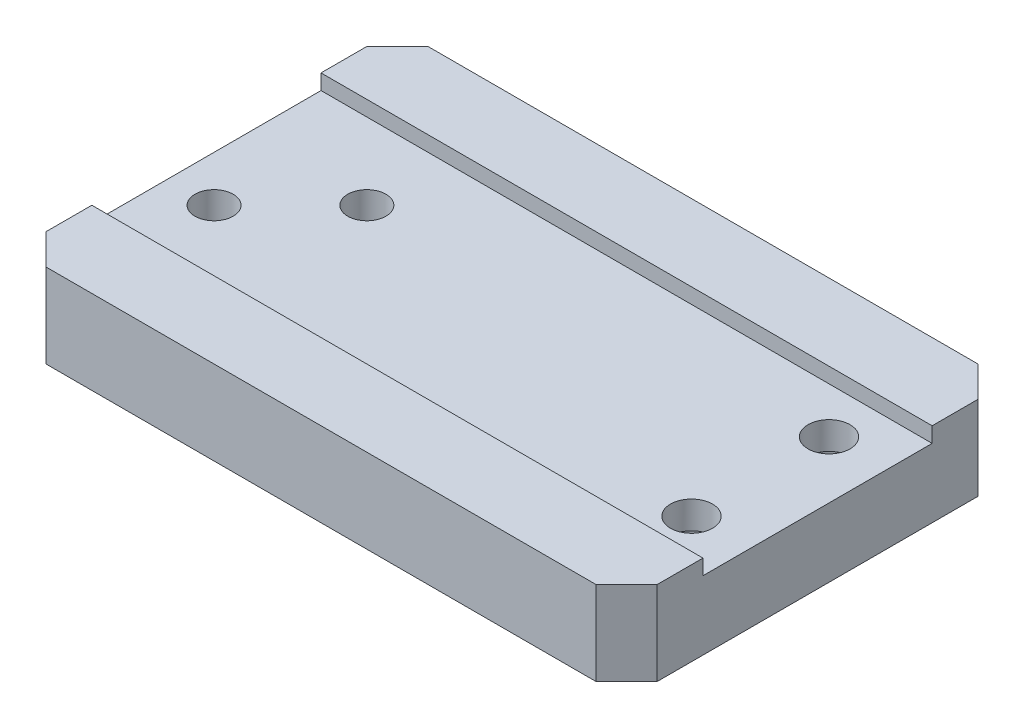
ISO-10303-21;
HEADER;
FILE_DESCRIPTION(('STEP AP214'),'2;1');
FILE_NAME('part.step','',(''),(''),'','','');
FILE_SCHEMA(('AUTOMOTIVE_DESIGN { 1 0 10303 214 1 1 1 1 }'));
ENDSEC;
DATA;
#1=APPLICATION_CONTEXT('core data for automotive mechanical design processes');
#2=APPLICATION_PROTOCOL_DEFINITION('international standard','automotive_design',2000,#1);
#3=PRODUCT_CONTEXT('',#1,'mechanical');
#4=PRODUCT('Part','Part','',(#3));
#5=PRODUCT_RELATED_PRODUCT_CATEGORY('part','',(#4));
#6=PRODUCT_DEFINITION_FORMATION('','',#4);
#7=PRODUCT_DEFINITION_CONTEXT('part definition',#1,'design');
#8=PRODUCT_DEFINITION('design','',#6,#7);
#9=PRODUCT_DEFINITION_SHAPE('','',#8);
#10=(LENGTH_UNIT() NAMED_UNIT(*) SI_UNIT(.MILLI.,.METRE.));
#11=(NAMED_UNIT(*) PLANE_ANGLE_UNIT() SI_UNIT($,.RADIAN.));
#12=(NAMED_UNIT(*) SI_UNIT($,.STERADIAN.) SOLID_ANGLE_UNIT());
#13=UNCERTAINTY_MEASURE_WITH_UNIT(LENGTH_MEASURE(1.E-05),#10,'distance_accuracy_value','');
#14=(GEOMETRIC_REPRESENTATION_CONTEXT(3) GLOBAL_UNCERTAINTY_ASSIGNED_CONTEXT((#13)) GLOBAL_UNIT_ASSIGNED_CONTEXT((#10,
#11,#12)) REPRESENTATION_CONTEXT('',''));
#15=CARTESIAN_POINT('',(0.,0.,0.));
#16=DIRECTION('',(0.,0.,1.));
#17=DIRECTION('',(1.,0.,0.));
#18=AXIS2_PLACEMENT_3D('',#15,#16,#17);
#19=CARTESIAN_POINT('',(72.5,0.,9.));
#20=DIRECTION('',(0.,1.,0.));
#21=DIRECTION('',(0.,0.,1.));
#22=AXIS2_PLACEMENT_3D('',#19,#20,#21);
#23=CYLINDRICAL_SURFACE('',#22,2.75000000000001);
#24=CARTESIAN_POINT('',(72.5,9.,9.));
#25=DIRECTION('',(0.,1.,0.));
#26=DIRECTION('',(0.,0.,1.));
#27=AXIS2_PLACEMENT_3D('',#24,#25,#26);
#28=CIRCLE('',#27,2.75000000000001);
#29=CARTESIAN_POINT('',(72.5,9.,11.75));
#30=VERTEX_POINT('',#29);
#31=EDGE_CURVE('E264',#30,#30,#28,.T.);
#32=ORIENTED_EDGE('',*,*,#31,.T.);
#33=EDGE_LOOP('',(#32));
#34=FACE_BOUND('',#33,.T.);
#35=CARTESIAN_POINT('',(72.5,5.4,9.));
#36=DIRECTION('',(0.,-1.,0.));
#37=DIRECTION('',(0.,0.,-1.));
#38=AXIS2_PLACEMENT_3D('',#35,#36,#37);
#39=CIRCLE('',#38,2.75000000000001);
#40=CARTESIAN_POINT('',(72.5,5.4,6.24999999999999));
#41=VERTEX_POINT('',#40);
#42=EDGE_CURVE('E53',#41,#41,#39,.F.);
#43=ORIENTED_EDGE('',*,*,#42,.F.);
#44=EDGE_LOOP('',(#43));
#45=FACE_BOUND('',#44,.T.);
#46=ADVANCED_FACE('F48',(#34,#45),#23,.F.);
#47=CARTESIAN_POINT('',(72.5,0.,-9.));
#48=DIRECTION('',(0.,1.,0.));
#49=DIRECTION('',(0.,0.,1.));
#50=AXIS2_PLACEMENT_3D('',#47,#48,#49);
#51=CYLINDRICAL_SURFACE('',#50,2.75000000000001);
#52=CARTESIAN_POINT('',(72.5,9.,-9.));
#53=DIRECTION('',(0.,1.,0.));
#54=DIRECTION('',(0.,0.,1.));
#55=AXIS2_PLACEMENT_3D('',#52,#53,#54);
#56=CIRCLE('',#55,2.75000000000001);
#57=CARTESIAN_POINT('',(72.5,9.,-6.24999999999999));
#58=VERTEX_POINT('',#57);
#59=EDGE_CURVE('E283',#58,#58,#56,.T.);
#60=ORIENTED_EDGE('',*,*,#59,.T.);
#61=EDGE_LOOP('',(#60));
#62=FACE_BOUND('',#61,.T.);
#63=CARTESIAN_POINT('',(72.5,5.4,-9.));
#64=DIRECTION('',(0.,-1.,0.));
#65=DIRECTION('',(0.,0.,-1.));
#66=AXIS2_PLACEMENT_3D('',#63,#64,#65);
#67=CIRCLE('',#66,2.75000000000001);
#68=CARTESIAN_POINT('',(72.5,5.4,-11.75));
#69=VERTEX_POINT('',#68);
#70=EDGE_CURVE('E254',#69,#69,#67,.F.);
#71=ORIENTED_EDGE('',*,*,#70,.F.);
#72=EDGE_LOOP('',(#71));
#73=FACE_BOUND('',#72,.T.);
#74=ADVANCED_FACE('F425',(#62,#73),#51,.F.);
#75=CARTESIAN_POINT('',(0.,11.,0.));
#76=DIRECTION('',(0.,1.,0.));
#77=DIRECTION('',(0.,0.,1.));
#78=AXIS2_PLACEMENT_3D('',#75,#76,#77);
#79=PLANE('',#78);
#80=DIRECTION('',(0.,0.,-1.));
#81=VECTOR('',#80,1.);
#82=CARTESIAN_POINT('',(80.,11.,25.));
#83=LINE('',#82,#81);
#84=CARTESIAN_POINT('',(80.,11.,-15.));
#85=VERTEX_POINT('',#84);
#86=CARTESIAN_POINT('',(80.,11.,-21.));
#87=VERTEX_POINT('',#86);
#88=EDGE_CURVE('E186',#85,#87,#83,.T.);
#89=ORIENTED_EDGE('',*,*,#88,.T.);
#90=DIRECTION('',(0.707106781186546,0.,0.707106781186549));
#91=VECTOR('',#90,1.);
#92=CARTESIAN_POINT('',(50.5000000000001,11.,-50.5));
#93=LINE('',#92,#91);
#94=CARTESIAN_POINT('',(76.,11.,-25.));
#95=VERTEX_POINT('',#94);
#96=EDGE_CURVE('E238',#87,#95,#93,.F.);
#97=ORIENTED_EDGE('',*,*,#96,.T.);
#98=DIRECTION('',(-1.,0.,0.));
#99=VECTOR('',#98,1.);
#100=CARTESIAN_POINT('',(80.,11.,-25.));
#101=LINE('',#100,#99);
#102=CARTESIAN_POINT('',(4.00000000000003,11.,-25.));
#103=VERTEX_POINT('',#102);
#104=EDGE_CURVE('E190',#95,#103,#101,.T.);
#105=ORIENTED_EDGE('',*,*,#104,.T.);
#106=DIRECTION('',(0.70710678118655,0.,-0.707106781186545));
#107=VECTOR('',#106,1.);
#108=CARTESIAN_POINT('',(-10.5,11.,-10.5000000000001));
#109=LINE('',#108,#107);
#110=CARTESIAN_POINT('',(0.,11.,-21.));
#111=VERTEX_POINT('',#110);
#112=EDGE_CURVE('E235',#103,#111,#109,.F.);
#113=ORIENTED_EDGE('',*,*,#112,.T.);
#114=DIRECTION('',(0.,0.,1.));
#115=VECTOR('',#114,1.);
#116=CARTESIAN_POINT('',(0.,11.,-25.));
#117=LINE('',#116,#115);
#118=CARTESIAN_POINT('',(0.,11.,-15.));
#119=VERTEX_POINT('',#118);
#120=EDGE_CURVE('E180',#111,#119,#117,.T.);
#121=ORIENTED_EDGE('',*,*,#120,.T.);
#122=DIRECTION('',(-1.,0.,0.));
#123=VECTOR('',#122,1.);
#124=CARTESIAN_POINT('',(0.,11.,-15.));
#125=LINE('',#124,#123);
#126=EDGE_CURVE('E165',#85,#119,#125,.T.);
#127=ORIENTED_EDGE('',*,*,#126,.F.);
#128=EDGE_LOOP('',(#89,#97,#105,#113,#121,#127));
#129=FACE_BOUND('',#128,.T.);
#130=ADVANCED_FACE('F325',(#129),#79,.T.);
#131=CARTESIAN_POINT('',(0.,11.,0.));
#132=DIRECTION('',(1.,0.,0.));
#133=DIRECTION('',(0.,0.,-1.));
#134=AXIS2_PLACEMENT_3D('',#131,#132,#133);
#135=PLANE('',#134);
#136=ORIENTED_EDGE('',*,*,#120,.F.);
#137=DIRECTION('',(0.,-1.,0.));
#138=VECTOR('',#137,1.);
#139=CARTESIAN_POINT('',(0.,11.,-21.));
#140=LINE('',#139,#138);
#141=CARTESIAN_POINT('',(0.,0.,-21.));
#142=VERTEX_POINT('',#141);
#143=EDGE_CURVE('E11',#111,#142,#140,.T.);
#144=ORIENTED_EDGE('',*,*,#143,.T.);
#145=DIRECTION('',(0.,0.,1.));
#146=VECTOR('',#145,1.);
#147=CARTESIAN_POINT('',(0.,0.,0.));
#148=LINE('',#147,#146);
#149=CARTESIAN_POINT('',(0.,0.,21.));
#150=VERTEX_POINT('',#149);
#151=EDGE_CURVE('E195',#142,#150,#148,.T.);
#152=ORIENTED_EDGE('',*,*,#151,.T.);
#153=DIRECTION('',(0.,1.,0.));
#154=VECTOR('',#153,1.);
#155=CARTESIAN_POINT('',(0.,11.,21.));
#156=LINE('',#155,#154);
#157=CARTESIAN_POINT('',(0.,11.,21.));
#158=VERTEX_POINT('',#157);
#159=EDGE_CURVE('E59',#150,#158,#156,.T.);
#160=ORIENTED_EDGE('',*,*,#159,.T.);
#161=CARTESIAN_POINT('',(0.,11.,15.));
#162=VERTEX_POINT('',#161);
#163=EDGE_CURVE('E169',#162,#158,#117,.T.);
#164=ORIENTED_EDGE('',*,*,#163,.F.);
#165=DIRECTION('',(0.,1.,0.));
#166=VECTOR('',#165,1.);
#167=CARTESIAN_POINT('',(0.,9.,15.));
#168=LINE('',#167,#166);
#169=CARTESIAN_POINT('',(0.,9.,15.));
#170=VERTEX_POINT('',#169);
#171=EDGE_CURVE('E148',#170,#162,#168,.T.);
#172=ORIENTED_EDGE('',*,*,#171,.F.);
#173=DIRECTION('',(0.,0.,1.));
#174=VECTOR('',#173,1.);
#175=CARTESIAN_POINT('',(0.,9.,-15.));
#176=LINE('',#175,#174);
#177=CARTESIAN_POINT('',(0.,9.,-15.));
#178=VERTEX_POINT('',#177);
#179=EDGE_CURVE('E156',#178,#170,#176,.T.);
#180=ORIENTED_EDGE('',*,*,#179,.F.);
#181=DIRECTION('',(0.,1.,0.));
#182=VECTOR('',#181,1.);
#183=CARTESIAN_POINT('',(0.,9.,-15.));
#184=LINE('',#183,#182);
#185=EDGE_CURVE('E199',#178,#119,#184,.T.);
#186=ORIENTED_EDGE('',*,*,#185,.T.);
#187=EDGE_LOOP('',(#136,#144,#152,#160,#164,#172,#180,#186));
#188=FACE_BOUND('',#187,.T.);
#189=ADVANCED_FACE('F168',(#188),#135,.F.);
#190=CARTESIAN_POINT('',(0.,11.,25.));
#191=DIRECTION('',(0.,0.,-1.));
#192=DIRECTION('',(-1.,0.,0.));
#193=AXIS2_PLACEMENT_3D('',#190,#191,#192);
#194=PLANE('',#193);
#195=DIRECTION('',(1.,0.,0.));
#196=VECTOR('',#195,1.);
#197=CARTESIAN_POINT('',(0.,0.,25.));
#198=LINE('',#197,#196);
#199=CARTESIAN_POINT('',(4.,0.,25.));
#200=VERTEX_POINT('',#199);
#201=CARTESIAN_POINT('',(76.,0.,25.));
#202=VERTEX_POINT('',#201);
#203=EDGE_CURVE('E198',#200,#202,#198,.T.);
#204=ORIENTED_EDGE('',*,*,#203,.T.);
#205=DIRECTION('',(0.,1.,0.));
#206=VECTOR('',#205,1.);
#207=CARTESIAN_POINT('',(76.,11.,25.));
#208=LINE('',#207,#206);
#209=CARTESIAN_POINT('',(76.,11.,25.));
#210=VERTEX_POINT('',#209);
#211=EDGE_CURVE('E74',#202,#210,#208,.T.);
#212=ORIENTED_EDGE('',*,*,#211,.T.);
#213=DIRECTION('',(1.,0.,0.));
#214=VECTOR('',#213,1.);
#215=CARTESIAN_POINT('',(0.,11.,25.));
#216=LINE('',#215,#214);
#217=CARTESIAN_POINT('',(4.,11.,25.));
#218=VERTEX_POINT('',#217);
#219=EDGE_CURVE('E183',#218,#210,#216,.T.);
#220=ORIENTED_EDGE('',*,*,#219,.F.);
#221=DIRECTION('',(0.,-1.,0.));
#222=VECTOR('',#221,1.);
#223=CARTESIAN_POINT('',(4.,11.,25.));
#224=LINE('',#223,#222);
#225=EDGE_CURVE('E241',#218,#200,#224,.T.);
#226=ORIENTED_EDGE('',*,*,#225,.T.);
#227=EDGE_LOOP('',(#204,#212,#220,#226));
#228=FACE_BOUND('',#227,.T.);
#229=ADVANCED_FACE('F394',(#228),#194,.F.);
#230=CARTESIAN_POINT('',(80.,11.,25.));
#231=DIRECTION('',(-1.,0.,0.));
#232=DIRECTION('',(0.,0.,1.));
#233=AXIS2_PLACEMENT_3D('',#230,#231,#232);
#234=PLANE('',#233);
#235=DIRECTION('',(0.,0.,-1.));
#236=VECTOR('',#235,1.);
#237=CARTESIAN_POINT('',(80.,0.,25.));
#238=LINE('',#237,#236);
#239=CARTESIAN_POINT('',(80.,0.,21.));
#240=VERTEX_POINT('',#239);
#241=CARTESIAN_POINT('',(80.,0.,-21.));
#242=VERTEX_POINT('',#241);
#243=EDGE_CURVE('E202',#240,#242,#238,.T.);
#244=ORIENTED_EDGE('',*,*,#243,.T.);
#245=DIRECTION('',(0.,1.,0.));
#246=VECTOR('',#245,1.);
#247=CARTESIAN_POINT('',(80.,11.,-21.));
#248=LINE('',#247,#246);
#249=EDGE_CURVE('E232',#242,#87,#248,.T.);
#250=ORIENTED_EDGE('',*,*,#249,.T.);
#251=ORIENTED_EDGE('',*,*,#88,.F.);
#252=DIRECTION('',(0.,1.,0.));
#253=VECTOR('',#252,1.);
#254=CARTESIAN_POINT('',(80.,9.,-15.));
#255=LINE('',#254,#253);
#256=CARTESIAN_POINT('',(80.,9.,-15.));
#257=VERTEX_POINT('',#256);
#258=EDGE_CURVE('E175',#257,#85,#255,.T.);
#259=ORIENTED_EDGE('',*,*,#258,.F.);
#260=DIRECTION('',(0.,0.,-1.));
#261=VECTOR('',#260,1.);
#262=CARTESIAN_POINT('',(80.,9.,-15.));
#263=LINE('',#262,#261);
#264=CARTESIAN_POINT('',(80.,9.,15.));
#265=VERTEX_POINT('',#264);
#266=EDGE_CURVE('E155',#265,#257,#263,.T.);
#267=ORIENTED_EDGE('',*,*,#266,.F.);
#268=DIRECTION('',(0.,1.,0.));
#269=VECTOR('',#268,1.);
#270=CARTESIAN_POINT('',(80.,9.,15.));
#271=LINE('',#270,#269);
#272=CARTESIAN_POINT('',(80.,11.,15.));
#273=VERTEX_POINT('',#272);
#274=EDGE_CURVE('E151',#265,#273,#271,.T.);
#275=ORIENTED_EDGE('',*,*,#274,.T.);
#276=CARTESIAN_POINT('',(80.,11.,21.));
#277=VERTEX_POINT('',#276);
#278=EDGE_CURVE('E187',#277,#273,#83,.T.);
#279=ORIENTED_EDGE('',*,*,#278,.F.);
#280=DIRECTION('',(0.,-1.,0.));
#281=VECTOR('',#280,1.);
#282=CARTESIAN_POINT('',(80.,11.,21.));
#283=LINE('',#282,#281);
#284=EDGE_CURVE('E228',#277,#240,#283,.T.);
#285=ORIENTED_EDGE('',*,*,#284,.T.);
#286=EDGE_LOOP('',(#244,#250,#251,#259,#267,#275,#279,#285));
#287=FACE_BOUND('',#286,.T.);
#288=ADVANCED_FACE('F327',(#287),#234,.F.);
#289=CARTESIAN_POINT('',(80.,11.,-25.));
#290=DIRECTION('',(0.,0.,1.));
#291=DIRECTION('',(1.,0.,0.));
#292=AXIS2_PLACEMENT_3D('',#289,#290,#291);
#293=PLANE('',#292);
#294=ORIENTED_EDGE('',*,*,#104,.F.);
#295=DIRECTION('',(0.,-1.,0.));
#296=VECTOR('',#295,1.);
#297=CARTESIAN_POINT('',(76.,11.,-25.));
#298=LINE('',#297,#296);
#299=CARTESIAN_POINT('',(76.,0.,-25.));
#300=VERTEX_POINT('',#299);
#301=EDGE_CURVE('E212',#95,#300,#298,.T.);
#302=ORIENTED_EDGE('',*,*,#301,.T.);
#303=DIRECTION('',(-1.,0.,0.));
#304=VECTOR('',#303,1.);
#305=CARTESIAN_POINT('',(80.,0.,-25.));
#306=LINE('',#305,#304);
#307=CARTESIAN_POINT('',(4.00000000000003,0.,-25.));
#308=VERTEX_POINT('',#307);
#309=EDGE_CURVE('E206',#300,#308,#306,.T.);
#310=ORIENTED_EDGE('',*,*,#309,.T.);
#311=DIRECTION('',(0.,1.,0.));
#312=VECTOR('',#311,1.);
#313=CARTESIAN_POINT('',(4.00000000000003,11.,-25.));
#314=LINE('',#313,#312);
#315=EDGE_CURVE('E194',#308,#103,#314,.T.);
#316=ORIENTED_EDGE('',*,*,#315,.T.);
#317=EDGE_LOOP('',(#294,#302,#310,#316));
#318=FACE_BOUND('',#317,.T.);
#319=ADVANCED_FACE('F411',(#318),#293,.F.);
#320=ORIENTED_EDGE('',*,*,#219,.T.);
#321=DIRECTION('',(-0.70710678118655,0.,0.707106781186545));
#322=VECTOR('',#321,1.);
#323=CARTESIAN_POINT('',(50.4999999999997,11.,50.5000000000001));
#324=LINE('',#323,#322);
#325=EDGE_CURVE('E250',#210,#277,#324,.F.);
#326=ORIENTED_EDGE('',*,*,#325,.T.);
#327=ORIENTED_EDGE('',*,*,#278,.T.);
#328=DIRECTION('',(1.,0.,0.));
#329=VECTOR('',#328,1.);
#330=CARTESIAN_POINT('',(0.,11.,15.));
#331=LINE('',#330,#329);
#332=EDGE_CURVE('E295',#162,#273,#331,.T.);
#333=ORIENTED_EDGE('',*,*,#332,.F.);
#334=ORIENTED_EDGE('',*,*,#163,.T.);
#335=DIRECTION('',(-0.707106781186545,0.,-0.70710678118655));
#336=VECTOR('',#335,1.);
#337=CARTESIAN_POINT('',(-10.5,11.,10.4999999999999));
#338=LINE('',#337,#336);
#339=EDGE_CURVE('E247',#158,#218,#338,.F.);
#340=ORIENTED_EDGE('',*,*,#339,.T.);
#341=EDGE_LOOP('',(#320,#326,#327,#333,#334,#340));
#342=FACE_BOUND('',#341,.T.);
#343=ADVANCED_FACE('F390',(#342),#79,.T.);
#344=CARTESIAN_POINT('',(0.,0.,0.));
#345=DIRECTION('',(0.,1.,0.));
#346=DIRECTION('',(0.,0.,1.));
#347=AXIS2_PLACEMENT_3D('',#344,#345,#346);
#348=PLANE('',#347);
#349=CARTESIAN_POINT('',(72.5,0.,9.));
#350=DIRECTION('',(0.,-1.,0.));
#351=DIRECTION('',(0.,0.,-1.));
#352=AXIS2_PLACEMENT_3D('',#349,#350,#351);
#353=CIRCLE('',#352,4.75000000000001);
#354=CARTESIAN_POINT('',(72.5,0.,4.24999999999999));
#355=VERTEX_POINT('',#354);
#356=EDGE_CURVE('E266',#355,#355,#353,.T.);
#357=ORIENTED_EDGE('',*,*,#356,.F.);
#358=EDGE_LOOP('',(#357));
#359=FACE_BOUND('',#358,.T.);
#360=CARTESIAN_POINT('',(72.5,0.,-9.));
#361=DIRECTION('',(0.,-1.,0.));
#362=DIRECTION('',(0.,0.,-1.));
#363=AXIS2_PLACEMENT_3D('',#360,#361,#362);
#364=CIRCLE('',#363,4.75);
#365=CARTESIAN_POINT('',(72.5,0.,-13.75));
#366=VERTEX_POINT('',#365);
#367=EDGE_CURVE('E273',#366,#366,#364,.T.);
#368=ORIENTED_EDGE('',*,*,#367,.F.);
#369=EDGE_LOOP('',(#368));
#370=FACE_BOUND('',#369,.T.);
#371=CARTESIAN_POINT('',(16.,0.,-5.));
#372=DIRECTION('',(0.,1.,0.));
#373=DIRECTION('',(0.,0.,1.));
#374=AXIS2_PLACEMENT_3D('',#371,#372,#373);
#375=CIRCLE('',#374,2.5);
#376=CARTESIAN_POINT('',(16.,0.,-2.5));
#377=VERTEX_POINT('',#376);
#378=EDGE_CURVE('E291',#377,#377,#375,.T.);
#379=ORIENTED_EDGE('',*,*,#378,.T.);
#380=EDGE_LOOP('',(#379));
#381=FACE_BOUND('',#380,.T.);
#382=CARTESIAN_POINT('',(6.,0.,5.));
#383=DIRECTION('',(0.,1.,0.));
#384=DIRECTION('',(0.,0.,1.));
#385=AXIS2_PLACEMENT_3D('',#382,#383,#384);
#386=CIRCLE('',#385,2.5);
#387=CARTESIAN_POINT('',(6.,0.,7.5));
#388=VERTEX_POINT('',#387);
#389=EDGE_CURVE('E287',#388,#388,#386,.T.);
#390=ORIENTED_EDGE('',*,*,#389,.T.);
#391=EDGE_LOOP('',(#390));
#392=FACE_BOUND('',#391,.T.);
#393=ORIENTED_EDGE('',*,*,#309,.F.);
#394=DIRECTION('',(-0.707106781186546,0.,-0.707106781186549));
#395=VECTOR('',#394,1.);
#396=CARTESIAN_POINT('',(76.,0.,-25.));
#397=LINE('',#396,#395);
#398=EDGE_CURVE('E225',#300,#242,#397,.F.);
#399=ORIENTED_EDGE('',*,*,#398,.T.);
#400=ORIENTED_EDGE('',*,*,#243,.F.);
#401=DIRECTION('',(0.70710678118655,0.,-0.707106781186545));
#402=VECTOR('',#401,1.);
#403=CARTESIAN_POINT('',(80.,0.,21.));
#404=LINE('',#403,#402);
#405=EDGE_CURVE('E222',#240,#202,#404,.F.);
#406=ORIENTED_EDGE('',*,*,#405,.T.);
#407=ORIENTED_EDGE('',*,*,#203,.F.);
#408=DIRECTION('',(0.707106781186545,0.,0.70710678118655));
#409=VECTOR('',#408,1.);
#410=CARTESIAN_POINT('',(4.,0.,25.));
#411=LINE('',#410,#409);
#412=EDGE_CURVE('E216',#200,#150,#411,.F.);
#413=ORIENTED_EDGE('',*,*,#412,.T.);
#414=ORIENTED_EDGE('',*,*,#151,.F.);
#415=DIRECTION('',(-0.70710678118655,0.,0.707106781186545));
#416=VECTOR('',#415,1.);
#417=CARTESIAN_POINT('',(0.,0.,-21.));
#418=LINE('',#417,#416);
#419=EDGE_CURVE('E219',#142,#308,#418,.F.);
#420=ORIENTED_EDGE('',*,*,#419,.T.);
#421=EDGE_LOOP('',(#393,#399,#400,#406,#407,#413,#414,#420));
#422=FACE_BOUND('',#421,.T.);
#423=ADVANCED_FACE('F397',(#359,#370,#381,#392,#422),#348,.F.);
#424=CARTESIAN_POINT('',(0.,9.,-15.));
#425=DIRECTION('',(0.,0.,-1.));
#426=DIRECTION('',(-1.,0.,0.));
#427=AXIS2_PLACEMENT_3D('',#424,#425,#426);
#428=PLANE('',#427);
#429=ORIENTED_EDGE('',*,*,#126,.T.);
#430=ORIENTED_EDGE('',*,*,#185,.F.);
#431=DIRECTION('',(-1.,0.,0.));
#432=VECTOR('',#431,1.);
#433=CARTESIAN_POINT('',(0.,9.,-15.));
#434=LINE('',#433,#432);
#435=EDGE_CURVE('E162',#257,#178,#434,.T.);
#436=ORIENTED_EDGE('',*,*,#435,.F.);
#437=ORIENTED_EDGE('',*,*,#258,.T.);
#438=EDGE_LOOP('',(#429,#430,#436,#437));
#439=FACE_BOUND('',#438,.T.);
#440=ADVANCED_FACE('F320',(#439),#428,.F.);
#441=CARTESIAN_POINT('',(0.,9.,15.));
#442=DIRECTION('',(0.,0.,1.));
#443=DIRECTION('',(1.,0.,0.));
#444=AXIS2_PLACEMENT_3D('',#441,#442,#443);
#445=PLANE('',#444);
#446=ORIENTED_EDGE('',*,*,#332,.T.);
#447=ORIENTED_EDGE('',*,*,#274,.F.);
#448=DIRECTION('',(1.,0.,0.));
#449=VECTOR('',#448,1.);
#450=CARTESIAN_POINT('',(0.,9.,15.));
#451=LINE('',#450,#449);
#452=EDGE_CURVE('E143',#170,#265,#451,.T.);
#453=ORIENTED_EDGE('',*,*,#452,.F.);
#454=ORIENTED_EDGE('',*,*,#171,.T.);
#455=EDGE_LOOP('',(#446,#447,#453,#454));
#456=FACE_BOUND('',#455,.T.);
#457=ADVANCED_FACE('F146',(#456),#445,.F.);
#458=CARTESIAN_POINT('',(0.,9.,0.));
#459=DIRECTION('',(0.,1.,0.));
#460=DIRECTION('',(0.,0.,1.));
#461=AXIS2_PLACEMENT_3D('',#458,#459,#460);
#462=PLANE('',#461);
#463=ORIENTED_EDGE('',*,*,#59,.F.);
#464=EDGE_LOOP('',(#463));
#465=FACE_BOUND('',#464,.T.);
#466=ORIENTED_EDGE('',*,*,#31,.F.);
#467=EDGE_LOOP('',(#466));
#468=FACE_BOUND('',#467,.T.);
#469=CARTESIAN_POINT('',(16.,9.,-5.));
#470=DIRECTION('',(0.,1.,0.));
#471=DIRECTION('',(0.,0.,1.));
#472=AXIS2_PLACEMENT_3D('',#469,#470,#471);
#473=CIRCLE('',#472,2.5);
#474=CARTESIAN_POINT('',(16.,9.,-2.5));
#475=VERTEX_POINT('',#474);
#476=EDGE_CURVE('E296',#475,#475,#473,.T.);
#477=ORIENTED_EDGE('',*,*,#476,.F.);
#478=EDGE_LOOP('',(#477));
#479=FACE_BOUND('',#478,.T.);
#480=CARTESIAN_POINT('',(6.,9.,5.));
#481=DIRECTION('',(0.,1.,0.));
#482=DIRECTION('',(0.,0.,1.));
#483=AXIS2_PLACEMENT_3D('',#480,#481,#482);
#484=CIRCLE('',#483,2.5);
#485=CARTESIAN_POINT('',(6.,9.,7.5));
#486=VERTEX_POINT('',#485);
#487=EDGE_CURVE('E300',#486,#486,#484,.T.);
#488=ORIENTED_EDGE('',*,*,#487,.F.);
#489=EDGE_LOOP('',(#488));
#490=FACE_BOUND('',#489,.T.);
#491=ORIENTED_EDGE('',*,*,#179,.T.);
#492=ORIENTED_EDGE('',*,*,#452,.T.);
#493=ORIENTED_EDGE('',*,*,#266,.T.);
#494=ORIENTED_EDGE('',*,*,#435,.T.);
#495=EDGE_LOOP('',(#491,#492,#493,#494));
#496=FACE_BOUND('',#495,.T.);
#497=ADVANCED_FACE('F160',(#465,#468,#479,#490,#496),#462,.T.);
#498=CARTESIAN_POINT('',(6.,0.,5.));
#499=DIRECTION('',(0.,1.,0.));
#500=DIRECTION('',(0.,0.,1.));
#501=AXIS2_PLACEMENT_3D('',#498,#499,#500);
#502=CYLINDRICAL_SURFACE('',#501,2.5);
#503=ORIENTED_EDGE('',*,*,#389,.F.);
#504=EDGE_LOOP('',(#503));
#505=FACE_BOUND('',#504,.T.);
#506=ORIENTED_EDGE('',*,*,#487,.T.);
#507=EDGE_LOOP('',(#506));
#508=FACE_BOUND('',#507,.T.);
#509=ADVANCED_FACE('F439',(#505,#508),#502,.F.);
#510=CARTESIAN_POINT('',(16.,0.,-5.));
#511=DIRECTION('',(0.,1.,0.));
#512=DIRECTION('',(0.,0.,1.));
#513=AXIS2_PLACEMENT_3D('',#510,#511,#512);
#514=CYLINDRICAL_SURFACE('',#513,2.5);
#515=ORIENTED_EDGE('',*,*,#378,.F.);
#516=EDGE_LOOP('',(#515));
#517=FACE_BOUND('',#516,.T.);
#518=ORIENTED_EDGE('',*,*,#476,.T.);
#519=EDGE_LOOP('',(#518));
#520=FACE_BOUND('',#519,.T.);
#521=ADVANCED_FACE('F436',(#517,#520),#514,.F.);
#522=CARTESIAN_POINT('',(76.,11.,-25.));
#523=DIRECTION('',(-0.707106781186549,0.,0.707106781186546));
#524=DIRECTION('',(0.,-1.,0.));
#525=AXIS2_PLACEMENT_3D('',#522,#523,#524);
#526=PLANE('',#525);
#527=ORIENTED_EDGE('',*,*,#96,.F.);
#528=ORIENTED_EDGE('',*,*,#249,.F.);
#529=ORIENTED_EDGE('',*,*,#398,.F.);
#530=ORIENTED_EDGE('',*,*,#301,.F.);
#531=EDGE_LOOP('',(#527,#528,#529,#530));
#532=FACE_BOUND('',#531,.T.);
#533=ADVANCED_FACE('F406',(#532),#526,.F.);
#534=CARTESIAN_POINT('',(80.,11.,21.));
#535=DIRECTION('',(-0.707106781186545,0.,-0.70710678118655));
#536=DIRECTION('',(0.,-1.,0.));
#537=AXIS2_PLACEMENT_3D('',#534,#535,#536);
#538=PLANE('',#537);
#539=ORIENTED_EDGE('',*,*,#325,.F.);
#540=ORIENTED_EDGE('',*,*,#211,.F.);
#541=ORIENTED_EDGE('',*,*,#405,.F.);
#542=ORIENTED_EDGE('',*,*,#284,.F.);
#543=EDGE_LOOP('',(#539,#540,#541,#542));
#544=FACE_BOUND('',#543,.T.);
#545=ADVANCED_FACE('F403',(#544),#538,.F.);
#546=CARTESIAN_POINT('',(0.,11.,-21.));
#547=DIRECTION('',(0.707106781186545,0.,0.70710678118655));
#548=DIRECTION('',(0.,-1.,0.));
#549=AXIS2_PLACEMENT_3D('',#546,#547,#548);
#550=PLANE('',#549);
#551=ORIENTED_EDGE('',*,*,#112,.F.);
#552=ORIENTED_EDGE('',*,*,#315,.F.);
#553=ORIENTED_EDGE('',*,*,#419,.F.);
#554=ORIENTED_EDGE('',*,*,#143,.F.);
#555=EDGE_LOOP('',(#551,#552,#553,#554));
#556=FACE_BOUND('',#555,.T.);
#557=ADVANCED_FACE('F414',(#556),#550,.F.);
#558=CARTESIAN_POINT('',(4.,11.,25.));
#559=DIRECTION('',(0.70710678118655,0.,-0.707106781186545));
#560=DIRECTION('',(0.,-1.,0.));
#561=AXIS2_PLACEMENT_3D('',#558,#559,#560);
#562=PLANE('',#561);
#563=ORIENTED_EDGE('',*,*,#339,.F.);
#564=ORIENTED_EDGE('',*,*,#159,.F.);
#565=ORIENTED_EDGE('',*,*,#412,.F.);
#566=ORIENTED_EDGE('',*,*,#225,.F.);
#567=EDGE_LOOP('',(#563,#564,#565,#566));
#568=FACE_BOUND('',#567,.T.);
#569=ADVANCED_FACE('F51',(#568),#562,.F.);
#570=CARTESIAN_POINT('',(72.5,5.4,-9.));
#571=DIRECTION('',(0.,-1.,0.));
#572=DIRECTION('',(0.,0.,-1.));
#573=AXIS2_PLACEMENT_3D('',#570,#571,#572);
#574=PLANE('',#573);
#575=CARTESIAN_POINT('',(72.5,5.4,-9.));
#576=DIRECTION('',(0.,-1.,0.));
#577=DIRECTION('',(0.,0.,-1.));
#578=AXIS2_PLACEMENT_3D('',#575,#576,#577);
#579=CIRCLE('',#578,4.75);
#580=CARTESIAN_POINT('',(72.5,5.4,-13.75));
#581=VERTEX_POINT('',#580);
#582=EDGE_CURVE('E279',#581,#581,#579,.T.);
#583=ORIENTED_EDGE('',*,*,#582,.T.);
#584=EDGE_LOOP('',(#583));
#585=FACE_BOUND('',#584,.T.);
#586=ORIENTED_EDGE('',*,*,#70,.T.);
#587=EDGE_LOOP('',(#586));
#588=FACE_BOUND('',#587,.T.);
#589=ADVANCED_FACE('F421',(#585,#588),#574,.T.);
#590=CARTESIAN_POINT('',(72.5,5.4,-9.));
#591=DIRECTION('',(0.,-1.,0.));
#592=DIRECTION('',(0.,0.,-1.));
#593=AXIS2_PLACEMENT_3D('',#590,#591,#592);
#594=CYLINDRICAL_SURFACE('',#593,4.75);
#595=CARTESIAN_POINT('',(72.5,5.4,-13.75));
#596=CARTESIAN_POINT('',(72.5,5.34375,-13.75));
#597=CARTESIAN_POINT('',(72.5,5.2875,-13.75));
#598=CARTESIAN_POINT('',(72.5,5.175,-13.75));
#599=CARTESIAN_POINT('',(72.5,5.11875,-13.75));
#600=CARTESIAN_POINT('',(72.5,5.00625,-13.75));
#601=CARTESIAN_POINT('',(72.5,4.95,-13.75));
#602=CARTESIAN_POINT('',(72.5,4.8375,-13.75));
#603=CARTESIAN_POINT('',(72.5,4.78125,-13.75));
#604=CARTESIAN_POINT('',(72.5,4.66875,-13.75));
#605=CARTESIAN_POINT('',(72.5,4.6125,-13.75));
#606=CARTESIAN_POINT('',(72.5,4.5,-13.75));
#607=CARTESIAN_POINT('',(72.5,4.44375,-13.75));
#608=CARTESIAN_POINT('',(72.5,4.33125,-13.75));
#609=CARTESIAN_POINT('',(72.5,4.275,-13.75));
#610=CARTESIAN_POINT('',(72.5,4.1625,-13.75));
#611=CARTESIAN_POINT('',(72.5,4.10625,-13.75));
#612=CARTESIAN_POINT('',(72.5,3.99375,-13.75));
#613=CARTESIAN_POINT('',(72.5,3.9375,-13.75));
#614=CARTESIAN_POINT('',(72.5,3.825,-13.75));
#615=CARTESIAN_POINT('',(72.5,3.76875,-13.75));
#616=CARTESIAN_POINT('',(72.5,3.65625,-13.75));
#617=CARTESIAN_POINT('',(72.5,3.6,-13.75));
#618=CARTESIAN_POINT('',(72.5,3.4875,-13.75));
#619=CARTESIAN_POINT('',(72.5,3.43125,-13.75));
#620=CARTESIAN_POINT('',(72.5,3.31875,-13.75));
#621=CARTESIAN_POINT('',(72.5,3.2625,-13.75));
#622=CARTESIAN_POINT('',(72.5,3.15,-13.75));
#623=CARTESIAN_POINT('',(72.5,3.09375,-13.75));
#624=CARTESIAN_POINT('',(72.5,2.98125,-13.75));
#625=CARTESIAN_POINT('',(72.5,2.925,-13.75));
#626=CARTESIAN_POINT('',(72.5,2.8125,-13.75));
#627=CARTESIAN_POINT('',(72.5,2.75625,-13.75));
#628=CARTESIAN_POINT('',(72.5,2.64375,-13.75));
#629=CARTESIAN_POINT('',(72.5,2.5875,-13.75));
#630=CARTESIAN_POINT('',(72.5,2.475,-13.75));
#631=CARTESIAN_POINT('',(72.5,2.41875,-13.75));
#632=CARTESIAN_POINT('',(72.5,2.30625,-13.75));
#633=CARTESIAN_POINT('',(72.5,2.25,-13.75));
#634=CARTESIAN_POINT('',(72.5,2.1375,-13.75));
#635=CARTESIAN_POINT('',(72.5,2.08125,-13.75));
#636=CARTESIAN_POINT('',(72.5,1.96875,-13.75));
#637=CARTESIAN_POINT('',(72.5,1.9125,-13.75));
#638=CARTESIAN_POINT('',(72.5,1.8,-13.75));
#639=CARTESIAN_POINT('',(72.5,1.74375,-13.75));
#640=CARTESIAN_POINT('',(72.5,1.63125,-13.75));
#641=CARTESIAN_POINT('',(72.5,1.575,-13.75));
#642=CARTESIAN_POINT('',(72.5,1.4625,-13.75));
#643=CARTESIAN_POINT('',(72.5,1.40625,-13.75));
#644=CARTESIAN_POINT('',(72.5,1.29375,-13.75));
#645=CARTESIAN_POINT('',(72.5,1.2375,-13.75));
#646=CARTESIAN_POINT('',(72.5,1.125,-13.75));
#647=CARTESIAN_POINT('',(72.5,1.06875,-13.75));
#648=CARTESIAN_POINT('',(72.5,0.956250000000001,-13.75));
#649=CARTESIAN_POINT('',(72.5,0.900000000000001,-13.75));
#650=CARTESIAN_POINT('',(72.5,0.787500000000001,-13.75));
#651=CARTESIAN_POINT('',(72.5,0.731250000000001,-13.75));
#652=CARTESIAN_POINT('',(72.5,0.618750000000001,-13.75));
#653=CARTESIAN_POINT('',(72.5,0.562500000000001,-13.75));
#654=CARTESIAN_POINT('',(72.5,0.450000000000001,-13.75));
#655=CARTESIAN_POINT('',(72.5,0.393750000000001,-13.75));
#656=CARTESIAN_POINT('',(72.5,0.281250000000001,-13.75));
#657=CARTESIAN_POINT('',(72.5,0.225000000000001,-13.75));
#658=CARTESIAN_POINT('',(72.5,0.112500000000001,-13.75));
#659=CARTESIAN_POINT('',(72.5,0.0562500000000007,-13.75));
#660=CARTESIAN_POINT('',(72.5,0.,-13.75));
#661=B_SPLINE_CURVE_WITH_KNOTS('',3,(#595,#596,#597,#598,#599,#600,#601,#602,#603,#604,#605,
#606,#607,#608,#609,#610,#611,#612,#613,#614,#615,#616,#617,#618,#619,#620,#621,#622,#623,#624,
#625,#626,#627,#628,#629,#630,#631,#632,#633,#634,#635,#636,#637,#638,#639,#640,#641,#642,#643,
#644,#645,#646,#647,#648,#649,#650,#651,#652,#653,#654,#655,#656,#657,#658,#659,#660),
.UNSPECIFIED.,.F.,.F.,(4,2,2,2,2,2,2,2,2,2,2,2,2,2,2,2,2,2,2,2,2,2,2,2,2,2,2,2,2,2,2,2,4),(0.,
0.168750000000001,0.3375,0.506250000000001,0.675,0.843750000000001,1.0125,1.18125,1.35,1.51875,
1.6875,1.85625,2.025,2.19375,2.3625,2.53125,2.7,2.86875,3.0375,3.20625,3.375,3.54375,3.7125,
3.88125,4.05,4.21875,4.3875,4.55625,4.725,4.89375,5.0625,5.23125,5.4),.UNSPECIFIED.);
#662=EDGE_CURVE('BSEAM503',#581,#366,#661,.T.);
#663=ORIENTED_EDGE('',*,*,#582,.F.);
#664=ORIENTED_EDGE('',*,*,#367,.T.);
#665=ORIENTED_EDGE('',*,*,#662,.T.);
#666=ORIENTED_EDGE('',*,*,#662,.F.);
#667=EDGE_LOOP('',(#663,#665,#664,#666));
#668=FACE_BOUND('',#667,.T.);
#669=ADVANCED_FACE('F503',(#668),#594,.F.);
#670=CARTESIAN_POINT('',(72.5,5.4,9.));
#671=DIRECTION('',(0.,-1.,0.));
#672=DIRECTION('',(0.,0.,-1.));
#673=AXIS2_PLACEMENT_3D('',#670,#671,#672);
#674=PLANE('',#673);
#675=CARTESIAN_POINT('',(72.5,5.4,9.));
#676=DIRECTION('',(0.,-1.,0.));
#677=DIRECTION('',(0.,0.,-1.));
#678=AXIS2_PLACEMENT_3D('',#675,#676,#677);
#679=CIRCLE('',#678,4.75000000000001);
#680=CARTESIAN_POINT('',(72.5,5.4,4.24999999999999));
#681=VERTEX_POINT('',#680);
#682=EDGE_CURVE('E257',#681,#681,#679,.T.);
#683=ORIENTED_EDGE('',*,*,#682,.T.);
#684=EDGE_LOOP('',(#683));
#685=FACE_BOUND('',#684,.T.);
#686=ORIENTED_EDGE('',*,*,#42,.T.);
#687=EDGE_LOOP('',(#686));
#688=FACE_BOUND('',#687,.T.);
#689=ADVANCED_FACE('F513',(#685,#688),#674,.T.);
#690=CARTESIAN_POINT('',(72.5,5.4,9.));
#691=DIRECTION('',(0.,-1.,0.));
#692=DIRECTION('',(0.,0.,-1.));
#693=AXIS2_PLACEMENT_3D('',#690,#691,#692);
#694=CYLINDRICAL_SURFACE('',#693,4.75000000000001);
#695=CARTESIAN_POINT('',(72.5,5.4,4.24999999999999));
#696=CARTESIAN_POINT('',(72.5,5.34375,4.24999999999999));
#697=CARTESIAN_POINT('',(72.5,5.2875,4.24999999999999));
#698=CARTESIAN_POINT('',(72.5,5.175,4.24999999999999));
#699=CARTESIAN_POINT('',(72.5,5.11875,4.24999999999999));
#700=CARTESIAN_POINT('',(72.5,5.00625,4.24999999999999));
#701=CARTESIAN_POINT('',(72.5,4.95,4.24999999999999));
#702=CARTESIAN_POINT('',(72.5,4.8375,4.24999999999999));
#703=CARTESIAN_POINT('',(72.5,4.78125,4.24999999999999));
#704=CARTESIAN_POINT('',(72.5,4.66875,4.24999999999999));
#705=CARTESIAN_POINT('',(72.5,4.6125,4.24999999999999));
#706=CARTESIAN_POINT('',(72.5,4.5,4.24999999999999));
#707=CARTESIAN_POINT('',(72.5,4.44375,4.24999999999999));
#708=CARTESIAN_POINT('',(72.5,4.33125,4.24999999999999));
#709=CARTESIAN_POINT('',(72.5,4.275,4.24999999999999));
#710=CARTESIAN_POINT('',(72.5,4.1625,4.24999999999999));
#711=CARTESIAN_POINT('',(72.5,4.10625,4.24999999999999));
#712=CARTESIAN_POINT('',(72.5,3.99375,4.24999999999999));
#713=CARTESIAN_POINT('',(72.5,3.9375,4.24999999999999));
#714=CARTESIAN_POINT('',(72.5,3.825,4.24999999999999));
#715=CARTESIAN_POINT('',(72.5,3.76875,4.24999999999999));
#716=CARTESIAN_POINT('',(72.5,3.65625,4.24999999999999));
#717=CARTESIAN_POINT('',(72.5,3.6,4.24999999999999));
#718=CARTESIAN_POINT('',(72.5,3.4875,4.24999999999999));
#719=CARTESIAN_POINT('',(72.5,3.43125,4.24999999999999));
#720=CARTESIAN_POINT('',(72.5,3.31875,4.24999999999999));
#721=CARTESIAN_POINT('',(72.5,3.2625,4.24999999999999));
#722=CARTESIAN_POINT('',(72.5,3.15,4.24999999999999));
#723=CARTESIAN_POINT('',(72.5,3.09375,4.24999999999999));
#724=CARTESIAN_POINT('',(72.5,2.98125,4.24999999999999));
#725=CARTESIAN_POINT('',(72.5,2.925,4.24999999999999));
#726=CARTESIAN_POINT('',(72.5,2.8125,4.24999999999999));
#727=CARTESIAN_POINT('',(72.5,2.75625,4.24999999999999));
#728=CARTESIAN_POINT('',(72.5,2.64375,4.24999999999999));
#729=CARTESIAN_POINT('',(72.5,2.5875,4.24999999999999));
#730=CARTESIAN_POINT('',(72.5,2.475,4.24999999999999));
#731=CARTESIAN_POINT('',(72.5,2.41875,4.24999999999999));
#732=CARTESIAN_POINT('',(72.5,2.30625,4.24999999999999));
#733=CARTESIAN_POINT('',(72.5,2.25,4.24999999999999));
#734=CARTESIAN_POINT('',(72.5,2.1375,4.24999999999999));
#735=CARTESIAN_POINT('',(72.5,2.08125,4.24999999999999));
#736=CARTESIAN_POINT('',(72.5,1.96875,4.24999999999999));
#737=CARTESIAN_POINT('',(72.5,1.9125,4.24999999999999));
#738=CARTESIAN_POINT('',(72.5,1.8,4.24999999999999));
#739=CARTESIAN_POINT('',(72.5,1.74375,4.24999999999999));
#740=CARTESIAN_POINT('',(72.5,1.63125,4.24999999999999));
#741=CARTESIAN_POINT('',(72.5,1.575,4.24999999999999));
#742=CARTESIAN_POINT('',(72.5,1.4625,4.24999999999999));
#743=CARTESIAN_POINT('',(72.5,1.40625,4.24999999999999));
#744=CARTESIAN_POINT('',(72.5,1.29375,4.24999999999999));
#745=CARTESIAN_POINT('',(72.5,1.2375,4.24999999999999));
#746=CARTESIAN_POINT('',(72.5,1.125,4.24999999999999));
#747=CARTESIAN_POINT('',(72.5,1.06875,4.24999999999999));
#748=CARTESIAN_POINT('',(72.5,0.956250000000001,4.24999999999999));
#749=CARTESIAN_POINT('',(72.5,0.900000000000001,4.24999999999999));
#750=CARTESIAN_POINT('',(72.5,0.787500000000001,4.24999999999999));
#751=CARTESIAN_POINT('',(72.5,0.731250000000001,4.24999999999999));
#752=CARTESIAN_POINT('',(72.5,0.618750000000001,4.24999999999999));
#753=CARTESIAN_POINT('',(72.5,0.562500000000001,4.24999999999999));
#754=CARTESIAN_POINT('',(72.5,0.450000000000001,4.24999999999999));
#755=CARTESIAN_POINT('',(72.5,0.393750000000001,4.24999999999999));
#756=CARTESIAN_POINT('',(72.5,0.281250000000001,4.24999999999999));
#757=CARTESIAN_POINT('',(72.5,0.225000000000001,4.24999999999999));
#758=CARTESIAN_POINT('',(72.5,0.112500000000001,4.24999999999999));
#759=CARTESIAN_POINT('',(72.5,0.0562500000000007,4.24999999999999));
#760=CARTESIAN_POINT('',(72.5,0.,4.24999999999999));
#761=B_SPLINE_CURVE_WITH_KNOTS('',3,(#695,#696,#697,#698,#699,#700,#701,#702,#703,#704,#705,
#706,#707,#708,#709,#710,#711,#712,#713,#714,#715,#716,#717,#718,#719,#720,#721,#722,#723,#724,
#725,#726,#727,#728,#729,#730,#731,#732,#733,#734,#735,#736,#737,#738,#739,#740,#741,#742,#743,
#744,#745,#746,#747,#748,#749,#750,#751,#752,#753,#754,#755,#756,#757,#758,#759,#760),
.UNSPECIFIED.,.F.,.F.,(4,2,2,2,2,2,2,2,2,2,2,2,2,2,2,2,2,2,2,2,2,2,2,2,2,2,2,2,2,2,2,2,4),(0.,
0.168750000000001,0.3375,0.506250000000001,0.675,0.843750000000001,1.0125,1.18125,1.35,1.51875,
1.6875,1.85625,2.025,2.19375,2.3625,2.53125,2.7,2.86875,3.0375,3.20625,3.375,3.54375,3.7125,
3.88125,4.05,4.21875,4.3875,4.55625,4.725,4.89375,5.0625,5.23125,5.4),.UNSPECIFIED.);
#762=EDGE_CURVE('BSEAM523',#681,#355,#761,.T.);
#763=ORIENTED_EDGE('',*,*,#682,.F.);
#764=ORIENTED_EDGE('',*,*,#356,.T.);
#765=ORIENTED_EDGE('',*,*,#762,.T.);
#766=ORIENTED_EDGE('',*,*,#762,.F.);
#767=EDGE_LOOP('',(#763,#765,#764,#766));
#768=FACE_BOUND('',#767,.T.);
#769=ADVANCED_FACE('F523',(#768),#694,.F.);
#770=CLOSED_SHELL('',(#46,#74,#130,#189,#229,#288,#319,#343,#423,#440,#457,#497,#509,#521,#533,
#545,#557,#569,#589,#669,#689,#769));
#771=MANIFOLD_SOLID_BREP('B2',#770);
#772=ADVANCED_BREP_SHAPE_REPRESENTATION('',(#18,#771),#14);
#773=SHAPE_DEFINITION_REPRESENTATION(#9,#772);
ENDSEC;
END-ISO-10303-21;
